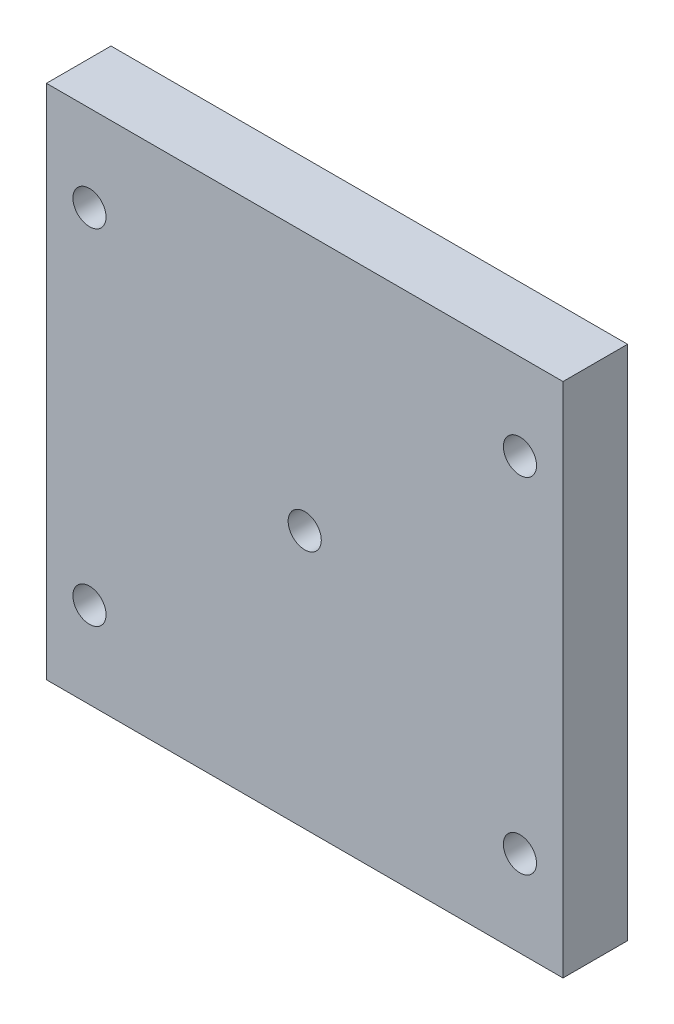
ISO-10303-21;
HEADER;
FILE_DESCRIPTION(('STEP AP214'),'2;1');
FILE_NAME('part.step','',(''),(''),'','','');
FILE_SCHEMA(('AUTOMOTIVE_DESIGN { 1 0 10303 214 1 1 1 1 }'));
ENDSEC;
DATA;
#1=APPLICATION_CONTEXT('core data for automotive mechanical design processes');
#2=APPLICATION_PROTOCOL_DEFINITION('international standard','automotive_design',2000,#1);
#3=PRODUCT_CONTEXT('',#1,'mechanical');
#4=PRODUCT('Part','Part','',(#3));
#5=PRODUCT_RELATED_PRODUCT_CATEGORY('part','',(#4));
#6=PRODUCT_DEFINITION_FORMATION('','',#4);
#7=PRODUCT_DEFINITION_CONTEXT('part definition',#1,'design');
#8=PRODUCT_DEFINITION('design','',#6,#7);
#9=PRODUCT_DEFINITION_SHAPE('','',#8);
#10=(LENGTH_UNIT() NAMED_UNIT(*) SI_UNIT(.MILLI.,.METRE.));
#11=(NAMED_UNIT(*) PLANE_ANGLE_UNIT() SI_UNIT($,.RADIAN.));
#12=(NAMED_UNIT(*) SI_UNIT($,.STERADIAN.) SOLID_ANGLE_UNIT());
#13=UNCERTAINTY_MEASURE_WITH_UNIT(LENGTH_MEASURE(1.E-05),#10,'distance_accuracy_value','');
#14=(GEOMETRIC_REPRESENTATION_CONTEXT(3) GLOBAL_UNCERTAINTY_ASSIGNED_CONTEXT((#13)) GLOBAL_UNIT_ASSIGNED_CONTEXT((#10,
#11,#12)) REPRESENTATION_CONTEXT('',''));
#15=CARTESIAN_POINT('',(0.,0.,0.));
#16=DIRECTION('',(0.,0.,1.));
#17=DIRECTION('',(1.,0.,0.));
#18=AXIS2_PLACEMENT_3D('',#15,#16,#17);
#19=CARTESIAN_POINT('',(-127.,101.6,0.));
#20=DIRECTION('',(0.,0.,1.));
#21=DIRECTION('',(1.,0.,0.));
#22=AXIS2_PLACEMENT_3D('',#19,#20,#21);
#23=CYLINDRICAL_SURFACE('',#22,6.5151);
#24=CARTESIAN_POINT('',(-127.,101.6,0.));
#25=DIRECTION('',(0.,0.,1.));
#26=DIRECTION('',(1.,0.,0.));
#27=AXIS2_PLACEMENT_3D('',#24,#25,#26);
#28=CIRCLE('',#27,6.5151);
#29=CARTESIAN_POINT('',(-120.4849,101.6,0.));
#30=VERTEX_POINT('',#29);
#31=EDGE_CURVE('E119',#30,#30,#28,.T.);
#32=CARTESIAN_POINT('',(-127.,101.6,15.875));
#33=DIRECTION('',(0.,0.,1.));
#34=DIRECTION('',(1.,0.,0.));
#35=AXIS2_PLACEMENT_3D('',#32,#33,#34);
#36=CIRCLE('',#35,6.5151);
#37=CARTESIAN_POINT('',(-120.4849,101.6,15.875));
#38=VERTEX_POINT('',#37);
#39=EDGE_CURVE('E53',#38,#38,#36,.F.);
#40=CARTESIAN_POINT('',(-120.4849,101.6,0.));
#41=CARTESIAN_POINT('',(-120.4849,101.6,0.165364583333334));
#42=CARTESIAN_POINT('',(-120.4849,101.6,0.330729166666667));
#43=CARTESIAN_POINT('',(-120.4849,101.6,0.661458333333333));
#44=CARTESIAN_POINT('',(-120.4849,101.6,0.826822916666666));
#45=CARTESIAN_POINT('',(-120.4849,101.6,1.15755208333333));
#46=CARTESIAN_POINT('',(-120.4849,101.6,1.32291666666667));
#47=CARTESIAN_POINT('',(-120.4849,101.6,1.65364583333333));
#48=CARTESIAN_POINT('',(-120.4849,101.6,1.81901041666667));
#49=CARTESIAN_POINT('',(-120.4849,101.6,2.14973958333333));
#50=CARTESIAN_POINT('',(-120.4849,101.6,2.31510416666667));
#51=CARTESIAN_POINT('',(-120.4849,101.6,2.64583333333333));
#52=CARTESIAN_POINT('',(-120.4849,101.6,2.81119791666667));
#53=CARTESIAN_POINT('',(-120.4849,101.6,3.14192708333333));
#54=CARTESIAN_POINT('',(-120.4849,101.6,3.30729166666667));
#55=CARTESIAN_POINT('',(-120.4849,101.6,3.63802083333333));
#56=CARTESIAN_POINT('',(-120.4849,101.6,3.80338541666667));
#57=CARTESIAN_POINT('',(-120.4849,101.6,4.13411458333333));
#58=CARTESIAN_POINT('',(-120.4849,101.6,4.29947916666667));
#59=CARTESIAN_POINT('',(-120.4849,101.6,4.63020833333333));
#60=CARTESIAN_POINT('',(-120.4849,101.6,4.79557291666667));
#61=CARTESIAN_POINT('',(-120.4849,101.6,5.12630208333333));
#62=CARTESIAN_POINT('',(-120.4849,101.6,5.29166666666667));
#63=CARTESIAN_POINT('',(-120.4849,101.6,5.62239583333333));
#64=CARTESIAN_POINT('',(-120.4849,101.6,5.78776041666667));
#65=CARTESIAN_POINT('',(-120.4849,101.6,6.11848958333333));
#66=CARTESIAN_POINT('',(-120.4849,101.6,6.28385416666667));
#67=CARTESIAN_POINT('',(-120.4849,101.6,6.61458333333333));
#68=CARTESIAN_POINT('',(-120.4849,101.6,6.77994791666667));
#69=CARTESIAN_POINT('',(-120.4849,101.6,7.11067708333333));
#70=CARTESIAN_POINT('',(-120.4849,101.6,7.27604166666667));
#71=CARTESIAN_POINT('',(-120.4849,101.6,7.60677083333333));
#72=CARTESIAN_POINT('',(-120.4849,101.6,7.77213541666667));
#73=CARTESIAN_POINT('',(-120.4849,101.6,8.10286458333333));
#74=CARTESIAN_POINT('',(-120.4849,101.6,8.26822916666666));
#75=CARTESIAN_POINT('',(-120.4849,101.6,8.59895833333333));
#76=CARTESIAN_POINT('',(-120.4849,101.6,8.76432291666666));
#77=CARTESIAN_POINT('',(-120.4849,101.6,9.09505208333333));
#78=CARTESIAN_POINT('',(-120.4849,101.6,9.26041666666666));
#79=CARTESIAN_POINT('',(-120.4849,101.6,9.59114583333333));
#80=CARTESIAN_POINT('',(-120.4849,101.6,9.75651041666667));
#81=CARTESIAN_POINT('',(-120.4849,101.6,10.0872395833333));
#82=CARTESIAN_POINT('',(-120.4849,101.6,10.2526041666667));
#83=CARTESIAN_POINT('',(-120.4849,101.6,10.5833333333333));
#84=CARTESIAN_POINT('',(-120.4849,101.6,10.7486979166667));
#85=CARTESIAN_POINT('',(-120.4849,101.6,11.0794270833333));
#86=CARTESIAN_POINT('',(-120.4849,101.6,11.2447916666667));
#87=CARTESIAN_POINT('',(-120.4849,101.6,11.5755208333333));
#88=CARTESIAN_POINT('',(-120.4849,101.6,11.7408854166667));
#89=CARTESIAN_POINT('',(-120.4849,101.6,12.0716145833333));
#90=CARTESIAN_POINT('',(-120.4849,101.6,12.2369791666667));
#91=CARTESIAN_POINT('',(-120.4849,101.6,12.5677083333333));
#92=CARTESIAN_POINT('',(-120.4849,101.6,12.7330729166667));
#93=CARTESIAN_POINT('',(-120.4849,101.6,13.0638020833333));
#94=CARTESIAN_POINT('',(-120.4849,101.6,13.2291666666667));
#95=CARTESIAN_POINT('',(-120.4849,101.6,13.5598958333333));
#96=CARTESIAN_POINT('',(-120.4849,101.6,13.7252604166667));
#97=CARTESIAN_POINT('',(-120.4849,101.6,14.0559895833333));
#98=CARTESIAN_POINT('',(-120.4849,101.6,14.2213541666667));
#99=CARTESIAN_POINT('',(-120.4849,101.6,14.5520833333333));
#100=CARTESIAN_POINT('',(-120.4849,101.6,14.7174479166667));
#101=CARTESIAN_POINT('',(-120.4849,101.6,15.0481770833333));
#102=CARTESIAN_POINT('',(-120.4849,101.6,15.2135416666667));
#103=CARTESIAN_POINT('',(-120.4849,101.6,15.5442708333333));
#104=CARTESIAN_POINT('',(-120.4849,101.6,15.7096354166667));
#105=CARTESIAN_POINT('',(-120.4849,101.6,15.875));
#106=B_SPLINE_CURVE_WITH_KNOTS('',3,(#40,#41,#42,#43,#44,#45,#46,#47,#48,#49,#50,#51,#52,#53,
#54,#55,#56,#57,#58,#59,#60,#61,#62,#63,#64,#65,#66,#67,#68,#69,#70,#71,#72,#73,#74,#75,#76,#77,
#78,#79,#80,#81,#82,#83,#84,#85,#86,#87,#88,#89,#90,#91,#92,#93,#94,#95,#96,#97,#98,#99,#100,
#101,#102,#103,#104,#105),.UNSPECIFIED.,.F.,.F.,(4,2,2,2,2,2,2,2,2,2,2,2,2,2,2,2,2,2,2,2,2,2,2,
2,2,2,2,2,2,2,2,2,4),(0.,0.49609375,0.9921875,1.48828125,1.984375,2.48046875,2.9765625,
3.47265625,3.96875,4.46484375,4.9609375,5.45703125,5.953125,6.44921875,6.9453125,7.44140625,
7.9375,8.43359375,8.9296875,9.42578125,9.921875,10.41796875,10.9140625,11.41015625,11.90625,
12.40234375,12.8984375,13.39453125,13.890625,14.38671875,14.8828125,15.37890625,15.875),.UNSPECIFIED.);
#107=EDGE_CURVE('BSEAM49',#30,#38,#106,.T.);
#108=ORIENTED_EDGE('',*,*,#31,.F.);
#109=ORIENTED_EDGE('',*,*,#39,.F.);
#110=ORIENTED_EDGE('',*,*,#107,.T.);
#111=ORIENTED_EDGE('',*,*,#107,.F.);
#112=EDGE_LOOP('',(#108,#110,#109,#111));
#113=FACE_BOUND('',#112,.T.);
#114=ADVANCED_FACE('F49',(#113),#23,.F.);
#115=CARTESIAN_POINT('',(127.,101.6,0.));
#116=DIRECTION('',(0.,0.,1.));
#117=DIRECTION('',(1.,0.,0.));
#118=AXIS2_PLACEMENT_3D('',#115,#116,#117);
#119=CYLINDRICAL_SURFACE('',#118,6.51509999999999);
#120=CARTESIAN_POINT('',(127.,101.6,0.));
#121=DIRECTION('',(0.,0.,1.));
#122=DIRECTION('',(1.,0.,0.));
#123=AXIS2_PLACEMENT_3D('',#120,#121,#122);
#124=CIRCLE('',#123,6.51509999999999);
#125=CARTESIAN_POINT('',(133.5151,101.6,0.));
#126=VERTEX_POINT('',#125);
#127=EDGE_CURVE('E157',#126,#126,#124,.T.);
#128=CARTESIAN_POINT('',(127.,101.6,15.875));
#129=DIRECTION('',(0.,0.,1.));
#130=DIRECTION('',(1.,0.,0.));
#131=AXIS2_PLACEMENT_3D('',#128,#129,#130);
#132=CIRCLE('',#131,6.51509999999999);
#133=CARTESIAN_POINT('',(133.5151,101.6,15.875));
#134=VERTEX_POINT('',#133);
#135=EDGE_CURVE('E134',#134,#134,#132,.F.);
#136=CARTESIAN_POINT('',(133.5151,101.6,0.));
#137=CARTESIAN_POINT('',(133.5151,101.6,0.165364583333334));
#138=CARTESIAN_POINT('',(133.5151,101.6,0.330729166666667));
#139=CARTESIAN_POINT('',(133.5151,101.6,0.661458333333333));
#140=CARTESIAN_POINT('',(133.5151,101.6,0.826822916666666));
#141=CARTESIAN_POINT('',(133.5151,101.6,1.15755208333333));
#142=CARTESIAN_POINT('',(133.5151,101.6,1.32291666666667));
#143=CARTESIAN_POINT('',(133.5151,101.6,1.65364583333333));
#144=CARTESIAN_POINT('',(133.5151,101.6,1.81901041666667));
#145=CARTESIAN_POINT('',(133.5151,101.6,2.14973958333333));
#146=CARTESIAN_POINT('',(133.5151,101.6,2.31510416666667));
#147=CARTESIAN_POINT('',(133.5151,101.6,2.64583333333333));
#148=CARTESIAN_POINT('',(133.5151,101.6,2.81119791666667));
#149=CARTESIAN_POINT('',(133.5151,101.6,3.14192708333333));
#150=CARTESIAN_POINT('',(133.5151,101.6,3.30729166666667));
#151=CARTESIAN_POINT('',(133.5151,101.6,3.63802083333333));
#152=CARTESIAN_POINT('',(133.5151,101.6,3.80338541666667));
#153=CARTESIAN_POINT('',(133.5151,101.6,4.13411458333333));
#154=CARTESIAN_POINT('',(133.5151,101.6,4.29947916666667));
#155=CARTESIAN_POINT('',(133.5151,101.6,4.63020833333333));
#156=CARTESIAN_POINT('',(133.5151,101.6,4.79557291666667));
#157=CARTESIAN_POINT('',(133.5151,101.6,5.12630208333333));
#158=CARTESIAN_POINT('',(133.5151,101.6,5.29166666666667));
#159=CARTESIAN_POINT('',(133.5151,101.6,5.62239583333333));
#160=CARTESIAN_POINT('',(133.5151,101.6,5.78776041666667));
#161=CARTESIAN_POINT('',(133.5151,101.6,6.11848958333333));
#162=CARTESIAN_POINT('',(133.5151,101.6,6.28385416666667));
#163=CARTESIAN_POINT('',(133.5151,101.6,6.61458333333333));
#164=CARTESIAN_POINT('',(133.5151,101.6,6.77994791666667));
#165=CARTESIAN_POINT('',(133.5151,101.6,7.11067708333333));
#166=CARTESIAN_POINT('',(133.5151,101.6,7.27604166666667));
#167=CARTESIAN_POINT('',(133.5151,101.6,7.60677083333333));
#168=CARTESIAN_POINT('',(133.5151,101.6,7.77213541666667));
#169=CARTESIAN_POINT('',(133.5151,101.6,8.10286458333333));
#170=CARTESIAN_POINT('',(133.5151,101.6,8.26822916666666));
#171=CARTESIAN_POINT('',(133.5151,101.6,8.59895833333333));
#172=CARTESIAN_POINT('',(133.5151,101.6,8.76432291666666));
#173=CARTESIAN_POINT('',(133.5151,101.6,9.09505208333333));
#174=CARTESIAN_POINT('',(133.5151,101.6,9.26041666666666));
#175=CARTESIAN_POINT('',(133.5151,101.6,9.59114583333333));
#176=CARTESIAN_POINT('',(133.5151,101.6,9.75651041666667));
#177=CARTESIAN_POINT('',(133.5151,101.6,10.0872395833333));
#178=CARTESIAN_POINT('',(133.5151,101.6,10.2526041666667));
#179=CARTESIAN_POINT('',(133.5151,101.6,10.5833333333333));
#180=CARTESIAN_POINT('',(133.5151,101.6,10.7486979166667));
#181=CARTESIAN_POINT('',(133.5151,101.6,11.0794270833333));
#182=CARTESIAN_POINT('',(133.5151,101.6,11.2447916666667));
#183=CARTESIAN_POINT('',(133.5151,101.6,11.5755208333333));
#184=CARTESIAN_POINT('',(133.5151,101.6,11.7408854166667));
#185=CARTESIAN_POINT('',(133.5151,101.6,12.0716145833333));
#186=CARTESIAN_POINT('',(133.5151,101.6,12.2369791666667));
#187=CARTESIAN_POINT('',(133.5151,101.6,12.5677083333333));
#188=CARTESIAN_POINT('',(133.5151,101.6,12.7330729166667));
#189=CARTESIAN_POINT('',(133.5151,101.6,13.0638020833333));
#190=CARTESIAN_POINT('',(133.5151,101.6,13.2291666666667));
#191=CARTESIAN_POINT('',(133.5151,101.6,13.5598958333333));
#192=CARTESIAN_POINT('',(133.5151,101.6,13.7252604166667));
#193=CARTESIAN_POINT('',(133.5151,101.6,14.0559895833333));
#194=CARTESIAN_POINT('',(133.5151,101.6,14.2213541666667));
#195=CARTESIAN_POINT('',(133.5151,101.6,14.5520833333333));
#196=CARTESIAN_POINT('',(133.5151,101.6,14.7174479166667));
#197=CARTESIAN_POINT('',(133.5151,101.6,15.0481770833333));
#198=CARTESIAN_POINT('',(133.5151,101.6,15.2135416666667));
#199=CARTESIAN_POINT('',(133.5151,101.6,15.5442708333333));
#200=CARTESIAN_POINT('',(133.5151,101.6,15.7096354166667));
#201=CARTESIAN_POINT('',(133.5151,101.6,15.875));
#202=B_SPLINE_CURVE_WITH_KNOTS('',3,(#136,#137,#138,#139,#140,#141,#142,#143,#144,#145,#146,
#147,#148,#149,#150,#151,#152,#153,#154,#155,#156,#157,#158,#159,#160,#161,#162,#163,#164,#165,
#166,#167,#168,#169,#170,#171,#172,#173,#174,#175,#176,#177,#178,#179,#180,#181,#182,#183,#184,
#185,#186,#187,#188,#189,#190,#191,#192,#193,#194,#195,#196,#197,#198,#199,#200,#201),
.UNSPECIFIED.,.F.,.F.,(4,2,2,2,2,2,2,2,2,2,2,2,2,2,2,2,2,2,2,2,2,2,2,2,2,2,2,2,2,2,2,2,4),(0.,
0.49609375,0.9921875,1.48828125,1.984375,2.48046875,2.9765625,3.47265625,3.96875,4.46484375,
4.9609375,5.45703125,5.953125,6.44921875,6.9453125,7.44140625,7.9375,8.43359375,8.9296875,
9.42578125,9.921875,10.41796875,10.9140625,11.41015625,11.90625,12.40234375,12.8984375,
13.39453125,13.890625,14.38671875,14.8828125,15.37890625,15.875),.UNSPECIFIED.);
#203=EDGE_CURVE('BSEAM222',#126,#134,#202,.T.);
#204=ORIENTED_EDGE('',*,*,#127,.F.);
#205=ORIENTED_EDGE('',*,*,#135,.F.);
#206=ORIENTED_EDGE('',*,*,#203,.T.);
#207=ORIENTED_EDGE('',*,*,#203,.F.);
#208=EDGE_LOOP('',(#204,#206,#205,#207));
#209=FACE_BOUND('',#208,.T.);
#210=ADVANCED_FACE('F222',(#209),#119,.F.);
#211=CARTESIAN_POINT('',(127.,-101.6,0.));
#212=DIRECTION('',(0.,0.,1.));
#213=DIRECTION('',(1.,0.,0.));
#214=AXIS2_PLACEMENT_3D('',#211,#212,#213);
#215=CYLINDRICAL_SURFACE('',#214,6.51509999999999);
#216=CARTESIAN_POINT('',(127.,-101.6,0.));
#217=DIRECTION('',(0.,0.,1.));
#218=DIRECTION('',(1.,0.,0.));
#219=AXIS2_PLACEMENT_3D('',#216,#217,#218);
#220=CIRCLE('',#219,6.51509999999999);
#221=CARTESIAN_POINT('',(133.5151,-101.6,0.));
#222=VERTEX_POINT('',#221);
#223=EDGE_CURVE('E151',#222,#222,#220,.T.);
#224=CARTESIAN_POINT('',(127.,-101.6,15.875));
#225=DIRECTION('',(0.,0.,1.));
#226=DIRECTION('',(1.,0.,0.));
#227=AXIS2_PLACEMENT_3D('',#224,#225,#226);
#228=CIRCLE('',#227,6.51509999999999);
#229=CARTESIAN_POINT('',(133.5151,-101.6,15.875));
#230=VERTEX_POINT('',#229);
#231=EDGE_CURVE('E132',#230,#230,#228,.F.);
#232=CARTESIAN_POINT('',(133.5151,-101.6,0.));
#233=CARTESIAN_POINT('',(133.5151,-101.6,0.165364583333334));
#234=CARTESIAN_POINT('',(133.5151,-101.6,0.330729166666667));
#235=CARTESIAN_POINT('',(133.5151,-101.6,0.661458333333333));
#236=CARTESIAN_POINT('',(133.5151,-101.6,0.826822916666666));
#237=CARTESIAN_POINT('',(133.5151,-101.6,1.15755208333333));
#238=CARTESIAN_POINT('',(133.5151,-101.6,1.32291666666667));
#239=CARTESIAN_POINT('',(133.5151,-101.6,1.65364583333333));
#240=CARTESIAN_POINT('',(133.5151,-101.6,1.81901041666667));
#241=CARTESIAN_POINT('',(133.5151,-101.6,2.14973958333333));
#242=CARTESIAN_POINT('',(133.5151,-101.6,2.31510416666667));
#243=CARTESIAN_POINT('',(133.5151,-101.6,2.64583333333333));
#244=CARTESIAN_POINT('',(133.5151,-101.6,2.81119791666667));
#245=CARTESIAN_POINT('',(133.5151,-101.6,3.14192708333333));
#246=CARTESIAN_POINT('',(133.5151,-101.6,3.30729166666667));
#247=CARTESIAN_POINT('',(133.5151,-101.6,3.63802083333333));
#248=CARTESIAN_POINT('',(133.5151,-101.6,3.80338541666667));
#249=CARTESIAN_POINT('',(133.5151,-101.6,4.13411458333333));
#250=CARTESIAN_POINT('',(133.5151,-101.6,4.29947916666667));
#251=CARTESIAN_POINT('',(133.5151,-101.6,4.63020833333333));
#252=CARTESIAN_POINT('',(133.5151,-101.6,4.79557291666667));
#253=CARTESIAN_POINT('',(133.5151,-101.6,5.12630208333333));
#254=CARTESIAN_POINT('',(133.5151,-101.6,5.29166666666667));
#255=CARTESIAN_POINT('',(133.5151,-101.6,5.62239583333333));
#256=CARTESIAN_POINT('',(133.5151,-101.6,5.78776041666667));
#257=CARTESIAN_POINT('',(133.5151,-101.6,6.11848958333333));
#258=CARTESIAN_POINT('',(133.5151,-101.6,6.28385416666667));
#259=CARTESIAN_POINT('',(133.5151,-101.6,6.61458333333333));
#260=CARTESIAN_POINT('',(133.5151,-101.6,6.77994791666667));
#261=CARTESIAN_POINT('',(133.5151,-101.6,7.11067708333333));
#262=CARTESIAN_POINT('',(133.5151,-101.6,7.27604166666667));
#263=CARTESIAN_POINT('',(133.5151,-101.6,7.60677083333333));
#264=CARTESIAN_POINT('',(133.5151,-101.6,7.77213541666667));
#265=CARTESIAN_POINT('',(133.5151,-101.6,8.10286458333333));
#266=CARTESIAN_POINT('',(133.5151,-101.6,8.26822916666666));
#267=CARTESIAN_POINT('',(133.5151,-101.6,8.59895833333333));
#268=CARTESIAN_POINT('',(133.5151,-101.6,8.76432291666666));
#269=CARTESIAN_POINT('',(133.5151,-101.6,9.09505208333333));
#270=CARTESIAN_POINT('',(133.5151,-101.6,9.26041666666666));
#271=CARTESIAN_POINT('',(133.5151,-101.6,9.59114583333333));
#272=CARTESIAN_POINT('',(133.5151,-101.6,9.75651041666667));
#273=CARTESIAN_POINT('',(133.5151,-101.6,10.0872395833333));
#274=CARTESIAN_POINT('',(133.5151,-101.6,10.2526041666667));
#275=CARTESIAN_POINT('',(133.5151,-101.6,10.5833333333333));
#276=CARTESIAN_POINT('',(133.5151,-101.6,10.7486979166667));
#277=CARTESIAN_POINT('',(133.5151,-101.6,11.0794270833333));
#278=CARTESIAN_POINT('',(133.5151,-101.6,11.2447916666667));
#279=CARTESIAN_POINT('',(133.5151,-101.6,11.5755208333333));
#280=CARTESIAN_POINT('',(133.5151,-101.6,11.7408854166667));
#281=CARTESIAN_POINT('',(133.5151,-101.6,12.0716145833333));
#282=CARTESIAN_POINT('',(133.5151,-101.6,12.2369791666667));
#283=CARTESIAN_POINT('',(133.5151,-101.6,12.5677083333333));
#284=CARTESIAN_POINT('',(133.5151,-101.6,12.7330729166667));
#285=CARTESIAN_POINT('',(133.5151,-101.6,13.0638020833333));
#286=CARTESIAN_POINT('',(133.5151,-101.6,13.2291666666667));
#287=CARTESIAN_POINT('',(133.5151,-101.6,13.5598958333333));
#288=CARTESIAN_POINT('',(133.5151,-101.6,13.7252604166667));
#289=CARTESIAN_POINT('',(133.5151,-101.6,14.0559895833333));
#290=CARTESIAN_POINT('',(133.5151,-101.6,14.2213541666667));
#291=CARTESIAN_POINT('',(133.5151,-101.6,14.5520833333333));
#292=CARTESIAN_POINT('',(133.5151,-101.6,14.7174479166667));
#293=CARTESIAN_POINT('',(133.5151,-101.6,15.0481770833333));
#294=CARTESIAN_POINT('',(133.5151,-101.6,15.2135416666667));
#295=CARTESIAN_POINT('',(133.5151,-101.6,15.5442708333333));
#296=CARTESIAN_POINT('',(133.5151,-101.6,15.7096354166667));
#297=CARTESIAN_POINT('',(133.5151,-101.6,15.875));
#298=B_SPLINE_CURVE_WITH_KNOTS('',3,(#232,#233,#234,#235,#236,#237,#238,#239,#240,#241,#242,
#243,#244,#245,#246,#247,#248,#249,#250,#251,#252,#253,#254,#255,#256,#257,#258,#259,#260,#261,
#262,#263,#264,#265,#266,#267,#268,#269,#270,#271,#272,#273,#274,#275,#276,#277,#278,#279,#280,
#281,#282,#283,#284,#285,#286,#287,#288,#289,#290,#291,#292,#293,#294,#295,#296,#297),
.UNSPECIFIED.,.F.,.F.,(4,2,2,2,2,2,2,2,2,2,2,2,2,2,2,2,2,2,2,2,2,2,2,2,2,2,2,2,2,2,2,2,4),(0.,
0.49609375,0.9921875,1.48828125,1.984375,2.48046875,2.9765625,3.47265625,3.96875,4.46484375,
4.9609375,5.45703125,5.953125,6.44921875,6.9453125,7.44140625,7.9375,8.43359375,8.9296875,
9.42578125,9.921875,10.41796875,10.9140625,11.41015625,11.90625,12.40234375,12.8984375,
13.39453125,13.890625,14.38671875,14.8828125,15.37890625,15.875),.UNSPECIFIED.);
#299=EDGE_CURVE('BSEAM229',#222,#230,#298,.T.);
#300=ORIENTED_EDGE('',*,*,#223,.F.);
#301=ORIENTED_EDGE('',*,*,#231,.F.);
#302=ORIENTED_EDGE('',*,*,#299,.T.);
#303=ORIENTED_EDGE('',*,*,#299,.F.);
#304=EDGE_LOOP('',(#300,#302,#301,#303));
#305=FACE_BOUND('',#304,.T.);
#306=ADVANCED_FACE('F229',(#305),#215,.F.);
#307=CARTESIAN_POINT('',(-127.,-101.6,0.));
#308=DIRECTION('',(0.,0.,1.));
#309=DIRECTION('',(1.,0.,0.));
#310=AXIS2_PLACEMENT_3D('',#307,#308,#309);
#311=CYLINDRICAL_SURFACE('',#310,6.5151);
#312=CARTESIAN_POINT('',(-127.,-101.6,0.));
#313=DIRECTION('',(0.,0.,1.));
#314=DIRECTION('',(1.,0.,0.));
#315=AXIS2_PLACEMENT_3D('',#312,#313,#314);
#316=CIRCLE('',#315,6.5151);
#317=CARTESIAN_POINT('',(-120.4849,-101.6,0.));
#318=VERTEX_POINT('',#317);
#319=EDGE_CURVE('E144',#318,#318,#316,.T.);
#320=CARTESIAN_POINT('',(-127.,-101.6,15.875));
#321=DIRECTION('',(0.,0.,1.));
#322=DIRECTION('',(1.,0.,0.));
#323=AXIS2_PLACEMENT_3D('',#320,#321,#322);
#324=CIRCLE('',#323,6.5151);
#325=CARTESIAN_POINT('',(-120.4849,-101.6,15.875));
#326=VERTEX_POINT('',#325);
#327=EDGE_CURVE('E128',#326,#326,#324,.F.);
#328=CARTESIAN_POINT('',(-120.4849,-101.6,0.));
#329=CARTESIAN_POINT('',(-120.4849,-101.6,0.165364583333334));
#330=CARTESIAN_POINT('',(-120.4849,-101.6,0.330729166666667));
#331=CARTESIAN_POINT('',(-120.4849,-101.6,0.661458333333333));
#332=CARTESIAN_POINT('',(-120.4849,-101.6,0.826822916666666));
#333=CARTESIAN_POINT('',(-120.4849,-101.6,1.15755208333333));
#334=CARTESIAN_POINT('',(-120.4849,-101.6,1.32291666666667));
#335=CARTESIAN_POINT('',(-120.4849,-101.6,1.65364583333333));
#336=CARTESIAN_POINT('',(-120.4849,-101.6,1.81901041666667));
#337=CARTESIAN_POINT('',(-120.4849,-101.6,2.14973958333333));
#338=CARTESIAN_POINT('',(-120.4849,-101.6,2.31510416666667));
#339=CARTESIAN_POINT('',(-120.4849,-101.6,2.64583333333333));
#340=CARTESIAN_POINT('',(-120.4849,-101.6,2.81119791666667));
#341=CARTESIAN_POINT('',(-120.4849,-101.6,3.14192708333333));
#342=CARTESIAN_POINT('',(-120.4849,-101.6,3.30729166666667));
#343=CARTESIAN_POINT('',(-120.4849,-101.6,3.63802083333333));
#344=CARTESIAN_POINT('',(-120.4849,-101.6,3.80338541666667));
#345=CARTESIAN_POINT('',(-120.4849,-101.6,4.13411458333333));
#346=CARTESIAN_POINT('',(-120.4849,-101.6,4.29947916666667));
#347=CARTESIAN_POINT('',(-120.4849,-101.6,4.63020833333333));
#348=CARTESIAN_POINT('',(-120.4849,-101.6,4.79557291666667));
#349=CARTESIAN_POINT('',(-120.4849,-101.6,5.12630208333333));
#350=CARTESIAN_POINT('',(-120.4849,-101.6,5.29166666666667));
#351=CARTESIAN_POINT('',(-120.4849,-101.6,5.62239583333333));
#352=CARTESIAN_POINT('',(-120.4849,-101.6,5.78776041666667));
#353=CARTESIAN_POINT('',(-120.4849,-101.6,6.11848958333333));
#354=CARTESIAN_POINT('',(-120.4849,-101.6,6.28385416666667));
#355=CARTESIAN_POINT('',(-120.4849,-101.6,6.61458333333333));
#356=CARTESIAN_POINT('',(-120.4849,-101.6,6.77994791666667));
#357=CARTESIAN_POINT('',(-120.4849,-101.6,7.11067708333333));
#358=CARTESIAN_POINT('',(-120.4849,-101.6,7.27604166666667));
#359=CARTESIAN_POINT('',(-120.4849,-101.6,7.60677083333333));
#360=CARTESIAN_POINT('',(-120.4849,-101.6,7.77213541666667));
#361=CARTESIAN_POINT('',(-120.4849,-101.6,8.10286458333333));
#362=CARTESIAN_POINT('',(-120.4849,-101.6,8.26822916666666));
#363=CARTESIAN_POINT('',(-120.4849,-101.6,8.59895833333333));
#364=CARTESIAN_POINT('',(-120.4849,-101.6,8.76432291666666));
#365=CARTESIAN_POINT('',(-120.4849,-101.6,9.09505208333333));
#366=CARTESIAN_POINT('',(-120.4849,-101.6,9.26041666666666));
#367=CARTESIAN_POINT('',(-120.4849,-101.6,9.59114583333333));
#368=CARTESIAN_POINT('',(-120.4849,-101.6,9.75651041666667));
#369=CARTESIAN_POINT('',(-120.4849,-101.6,10.0872395833333));
#370=CARTESIAN_POINT('',(-120.4849,-101.6,10.2526041666667));
#371=CARTESIAN_POINT('',(-120.4849,-101.6,10.5833333333333));
#372=CARTESIAN_POINT('',(-120.4849,-101.6,10.7486979166667));
#373=CARTESIAN_POINT('',(-120.4849,-101.6,11.0794270833333));
#374=CARTESIAN_POINT('',(-120.4849,-101.6,11.2447916666667));
#375=CARTESIAN_POINT('',(-120.4849,-101.6,11.5755208333333));
#376=CARTESIAN_POINT('',(-120.4849,-101.6,11.7408854166667));
#377=CARTESIAN_POINT('',(-120.4849,-101.6,12.0716145833333));
#378=CARTESIAN_POINT('',(-120.4849,-101.6,12.2369791666667));
#379=CARTESIAN_POINT('',(-120.4849,-101.6,12.5677083333333));
#380=CARTESIAN_POINT('',(-120.4849,-101.6,12.7330729166667));
#381=CARTESIAN_POINT('',(-120.4849,-101.6,13.0638020833333));
#382=CARTESIAN_POINT('',(-120.4849,-101.6,13.2291666666667));
#383=CARTESIAN_POINT('',(-120.4849,-101.6,13.5598958333333));
#384=CARTESIAN_POINT('',(-120.4849,-101.6,13.7252604166667));
#385=CARTESIAN_POINT('',(-120.4849,-101.6,14.0559895833333));
#386=CARTESIAN_POINT('',(-120.4849,-101.6,14.2213541666667));
#387=CARTESIAN_POINT('',(-120.4849,-101.6,14.5520833333333));
#388=CARTESIAN_POINT('',(-120.4849,-101.6,14.7174479166667));
#389=CARTESIAN_POINT('',(-120.4849,-101.6,15.0481770833333));
#390=CARTESIAN_POINT('',(-120.4849,-101.6,15.2135416666667));
#391=CARTESIAN_POINT('',(-120.4849,-101.6,15.5442708333333));
#392=CARTESIAN_POINT('',(-120.4849,-101.6,15.7096354166667));
#393=CARTESIAN_POINT('',(-120.4849,-101.6,15.875));
#394=B_SPLINE_CURVE_WITH_KNOTS('',3,(#328,#329,#330,#331,#332,#333,#334,#335,#336,#337,#338,
#339,#340,#341,#342,#343,#344,#345,#346,#347,#348,#349,#350,#351,#352,#353,#354,#355,#356,#357,
#358,#359,#360,#361,#362,#363,#364,#365,#366,#367,#368,#369,#370,#371,#372,#373,#374,#375,#376,
#377,#378,#379,#380,#381,#382,#383,#384,#385,#386,#387,#388,#389,#390,#391,#392,#393),
.UNSPECIFIED.,.F.,.F.,(4,2,2,2,2,2,2,2,2,2,2,2,2,2,2,2,2,2,2,2,2,2,2,2,2,2,2,2,2,2,2,2,4),(0.,
0.49609375,0.9921875,1.48828125,1.984375,2.48046875,2.9765625,3.47265625,3.96875,4.46484375,
4.9609375,5.45703125,5.953125,6.44921875,6.9453125,7.44140625,7.9375,8.43359375,8.9296875,
9.42578125,9.921875,10.41796875,10.9140625,11.41015625,11.90625,12.40234375,12.8984375,
13.39453125,13.890625,14.38671875,14.8828125,15.37890625,15.875),.UNSPECIFIED.);
#395=EDGE_CURVE('BSEAM255',#318,#326,#394,.T.);
#396=ORIENTED_EDGE('',*,*,#319,.F.);
#397=ORIENTED_EDGE('',*,*,#327,.F.);
#398=ORIENTED_EDGE('',*,*,#395,.T.);
#399=ORIENTED_EDGE('',*,*,#395,.F.);
#400=EDGE_LOOP('',(#396,#398,#397,#399));
#401=FACE_BOUND('',#400,.T.);
#402=ADVANCED_FACE('F255',(#401),#311,.F.);
#403=CARTESIAN_POINT('',(0.,0.,0.));
#404=DIRECTION('',(0.,0.,1.));
#405=DIRECTION('',(1.,0.,0.));
#406=AXIS2_PLACEMENT_3D('',#403,#404,#405);
#407=CYLINDRICAL_SURFACE('',#406,6.5151);
#408=CARTESIAN_POINT('',(0.,0.,0.));
#409=DIRECTION('',(0.,0.,1.));
#410=DIRECTION('',(1.,0.,0.));
#411=AXIS2_PLACEMENT_3D('',#408,#409,#410);
#412=CIRCLE('',#411,6.5151);
#413=CARTESIAN_POINT('',(6.51509999999997,0.,0.));
#414=VERTEX_POINT('',#413);
#415=EDGE_CURVE('E139',#414,#414,#412,.T.);
#416=CARTESIAN_POINT('',(0.,0.,15.875));
#417=DIRECTION('',(0.,0.,1.));
#418=DIRECTION('',(1.,0.,0.));
#419=AXIS2_PLACEMENT_3D('',#416,#417,#418);
#420=CIRCLE('',#419,6.5151);
#421=CARTESIAN_POINT('',(6.51509999999997,0.,15.875));
#422=VERTEX_POINT('',#421);
#423=EDGE_CURVE('E125',#422,#422,#420,.F.);
#424=CARTESIAN_POINT('',(6.51509999999997,0.,0.));
#425=CARTESIAN_POINT('',(6.51509999999997,0.,0.165364583333334));
#426=CARTESIAN_POINT('',(6.51509999999997,0.,0.330729166666667));
#427=CARTESIAN_POINT('',(6.51509999999997,0.,0.661458333333333));
#428=CARTESIAN_POINT('',(6.51509999999997,0.,0.826822916666666));
#429=CARTESIAN_POINT('',(6.51509999999997,0.,1.15755208333333));
#430=CARTESIAN_POINT('',(6.51509999999997,0.,1.32291666666667));
#431=CARTESIAN_POINT('',(6.51509999999997,0.,1.65364583333333));
#432=CARTESIAN_POINT('',(6.51509999999997,0.,1.81901041666667));
#433=CARTESIAN_POINT('',(6.51509999999997,0.,2.14973958333333));
#434=CARTESIAN_POINT('',(6.51509999999997,0.,2.31510416666667));
#435=CARTESIAN_POINT('',(6.51509999999997,0.,2.64583333333333));
#436=CARTESIAN_POINT('',(6.51509999999997,0.,2.81119791666667));
#437=CARTESIAN_POINT('',(6.51509999999997,0.,3.14192708333333));
#438=CARTESIAN_POINT('',(6.51509999999997,0.,3.30729166666667));
#439=CARTESIAN_POINT('',(6.51509999999997,0.,3.63802083333333));
#440=CARTESIAN_POINT('',(6.51509999999997,0.,3.80338541666667));
#441=CARTESIAN_POINT('',(6.51509999999997,0.,4.13411458333333));
#442=CARTESIAN_POINT('',(6.51509999999997,0.,4.29947916666667));
#443=CARTESIAN_POINT('',(6.51509999999997,0.,4.63020833333333));
#444=CARTESIAN_POINT('',(6.51509999999997,0.,4.79557291666667));
#445=CARTESIAN_POINT('',(6.51509999999997,0.,5.12630208333333));
#446=CARTESIAN_POINT('',(6.51509999999997,0.,5.29166666666667));
#447=CARTESIAN_POINT('',(6.51509999999997,0.,5.62239583333333));
#448=CARTESIAN_POINT('',(6.51509999999997,0.,5.78776041666667));
#449=CARTESIAN_POINT('',(6.51509999999997,0.,6.11848958333333));
#450=CARTESIAN_POINT('',(6.51509999999997,0.,6.28385416666667));
#451=CARTESIAN_POINT('',(6.51509999999997,0.,6.61458333333333));
#452=CARTESIAN_POINT('',(6.51509999999997,0.,6.77994791666667));
#453=CARTESIAN_POINT('',(6.51509999999997,0.,7.11067708333333));
#454=CARTESIAN_POINT('',(6.51509999999997,0.,7.27604166666667));
#455=CARTESIAN_POINT('',(6.51509999999997,0.,7.60677083333333));
#456=CARTESIAN_POINT('',(6.51509999999997,0.,7.77213541666667));
#457=CARTESIAN_POINT('',(6.51509999999997,0.,8.10286458333333));
#458=CARTESIAN_POINT('',(6.51509999999997,0.,8.26822916666666));
#459=CARTESIAN_POINT('',(6.51509999999997,0.,8.59895833333333));
#460=CARTESIAN_POINT('',(6.51509999999997,0.,8.76432291666666));
#461=CARTESIAN_POINT('',(6.51509999999997,0.,9.09505208333333));
#462=CARTESIAN_POINT('',(6.51509999999997,0.,9.26041666666666));
#463=CARTESIAN_POINT('',(6.51509999999997,0.,9.59114583333333));
#464=CARTESIAN_POINT('',(6.51509999999997,0.,9.75651041666667));
#465=CARTESIAN_POINT('',(6.51509999999997,0.,10.0872395833333));
#466=CARTESIAN_POINT('',(6.51509999999997,0.,10.2526041666667));
#467=CARTESIAN_POINT('',(6.51509999999997,0.,10.5833333333333));
#468=CARTESIAN_POINT('',(6.51509999999997,0.,10.7486979166667));
#469=CARTESIAN_POINT('',(6.51509999999997,0.,11.0794270833333));
#470=CARTESIAN_POINT('',(6.51509999999997,0.,11.2447916666667));
#471=CARTESIAN_POINT('',(6.51509999999997,0.,11.5755208333333));
#472=CARTESIAN_POINT('',(6.51509999999997,0.,11.7408854166667));
#473=CARTESIAN_POINT('',(6.51509999999997,0.,12.0716145833333));
#474=CARTESIAN_POINT('',(6.51509999999997,0.,12.2369791666667));
#475=CARTESIAN_POINT('',(6.51509999999997,0.,12.5677083333333));
#476=CARTESIAN_POINT('',(6.51509999999997,0.,12.7330729166667));
#477=CARTESIAN_POINT('',(6.51509999999997,0.,13.0638020833333));
#478=CARTESIAN_POINT('',(6.51509999999997,0.,13.2291666666667));
#479=CARTESIAN_POINT('',(6.51509999999997,0.,13.5598958333333));
#480=CARTESIAN_POINT('',(6.51509999999997,0.,13.7252604166667));
#481=CARTESIAN_POINT('',(6.51509999999997,0.,14.0559895833333));
#482=CARTESIAN_POINT('',(6.51509999999997,0.,14.2213541666667));
#483=CARTESIAN_POINT('',(6.51509999999997,0.,14.5520833333333));
#484=CARTESIAN_POINT('',(6.51509999999997,0.,14.7174479166667));
#485=CARTESIAN_POINT('',(6.51509999999997,0.,15.0481770833333));
#486=CARTESIAN_POINT('',(6.51509999999997,0.,15.2135416666667));
#487=CARTESIAN_POINT('',(6.51509999999997,0.,15.5442708333333));
#488=CARTESIAN_POINT('',(6.51509999999997,0.,15.7096354166667));
#489=CARTESIAN_POINT('',(6.51509999999997,0.,15.875));
#490=B_SPLINE_CURVE_WITH_KNOTS('',3,(#424,#425,#426,#427,#428,#429,#430,#431,#432,#433,#434,
#435,#436,#437,#438,#439,#440,#441,#442,#443,#444,#445,#446,#447,#448,#449,#450,#451,#452,#453,
#454,#455,#456,#457,#458,#459,#460,#461,#462,#463,#464,#465,#466,#467,#468,#469,#470,#471,#472,
#473,#474,#475,#476,#477,#478,#479,#480,#481,#482,#483,#484,#485,#486,#487,#488,#489),
.UNSPECIFIED.,.F.,.F.,(4,2,2,2,2,2,2,2,2,2,2,2,2,2,2,2,2,2,2,2,2,2,2,2,2,2,2,2,2,2,2,2,4),(0.,
0.49609375,0.9921875,1.48828125,1.984375,2.48046875,2.9765625,3.47265625,3.96875,4.46484375,
4.9609375,5.45703125,5.953125,6.44921875,6.9453125,7.44140625,7.9375,8.43359375,8.9296875,
9.42578125,9.921875,10.41796875,10.9140625,11.41015625,11.90625,12.40234375,12.8984375,
13.39453125,13.890625,14.38671875,14.8828125,15.37890625,15.875),.UNSPECIFIED.);
#491=EDGE_CURVE('BSEAM235',#414,#422,#490,.T.);
#492=ORIENTED_EDGE('',*,*,#415,.F.);
#493=ORIENTED_EDGE('',*,*,#423,.F.);
#494=ORIENTED_EDGE('',*,*,#491,.T.);
#495=ORIENTED_EDGE('',*,*,#491,.F.);
#496=EDGE_LOOP('',(#492,#494,#493,#495));
#497=FACE_BOUND('',#496,.T.);
#498=ADVANCED_FACE('F235',(#497),#407,.F.);
#499=CARTESIAN_POINT('',(152.4,152.4,38.1));
#500=DIRECTION('',(-1.,0.,0.));
#501=DIRECTION('',(0.,0.,1.));
#502=AXIS2_PLACEMENT_3D('',#499,#500,#501);
#503=PLANE('',#502);
#504=DIRECTION('',(0.,1.,0.));
#505=VECTOR('',#504,1.);
#506=CARTESIAN_POINT('',(152.4,152.4,0.));
#507=LINE('',#506,#505);
#508=CARTESIAN_POINT('',(152.4,-152.4,0.));
#509=VERTEX_POINT('',#508);
#510=CARTESIAN_POINT('',(152.4,152.4,0.));
#511=VERTEX_POINT('',#510);
#512=EDGE_CURVE('E116',#509,#511,#507,.T.);
#513=ORIENTED_EDGE('',*,*,#512,.T.);
#514=DIRECTION('',(0.,0.,-1.));
#515=VECTOR('',#514,1.);
#516=CARTESIAN_POINT('',(152.4,152.4,38.1));
#517=LINE('',#516,#515);
#518=CARTESIAN_POINT('',(152.4,152.4,38.1));
#519=VERTEX_POINT('',#518);
#520=EDGE_CURVE('E12',#519,#511,#517,.T.);
#521=ORIENTED_EDGE('',*,*,#520,.F.);
#522=DIRECTION('',(0.,1.,0.));
#523=VECTOR('',#522,1.);
#524=CARTESIAN_POINT('',(152.4,152.4,38.1));
#525=LINE('',#524,#523);
#526=CARTESIAN_POINT('',(152.4,-152.4,38.1));
#527=VERTEX_POINT('',#526);
#528=EDGE_CURVE('E103',#527,#519,#525,.T.);
#529=ORIENTED_EDGE('',*,*,#528,.F.);
#530=DIRECTION('',(0.,0.,-1.));
#531=VECTOR('',#530,1.);
#532=CARTESIAN_POINT('',(152.4,-152.4,38.1));
#533=LINE('',#532,#531);
#534=EDGE_CURVE('E112',#527,#509,#533,.T.);
#535=ORIENTED_EDGE('',*,*,#534,.T.);
#536=EDGE_LOOP('',(#513,#521,#529,#535));
#537=FACE_BOUND('',#536,.T.);
#538=ADVANCED_FACE('F51',(#537),#503,.F.);
#539=CARTESIAN_POINT('',(-152.4,152.4,38.1));
#540=DIRECTION('',(0.,-1.,0.));
#541=DIRECTION('',(0.,0.,-1.));
#542=AXIS2_PLACEMENT_3D('',#539,#540,#541);
#543=PLANE('',#542);
#544=DIRECTION('',(-1.,0.,0.));
#545=VECTOR('',#544,1.);
#546=CARTESIAN_POINT('',(-152.4,152.4,0.));
#547=LINE('',#546,#545);
#548=CARTESIAN_POINT('',(-152.4,152.4,0.));
#549=VERTEX_POINT('',#548);
#550=EDGE_CURVE('E107',#511,#549,#547,.T.);
#551=ORIENTED_EDGE('',*,*,#550,.T.);
#552=DIRECTION('',(0.,0.,-1.));
#553=VECTOR('',#552,1.);
#554=CARTESIAN_POINT('',(-152.4,152.4,38.1));
#555=LINE('',#554,#553);
#556=CARTESIAN_POINT('',(-152.4,152.4,38.1));
#557=VERTEX_POINT('',#556);
#558=EDGE_CURVE('E59',#557,#549,#555,.T.);
#559=ORIENTED_EDGE('',*,*,#558,.F.);
#560=DIRECTION('',(-1.,0.,0.));
#561=VECTOR('',#560,1.);
#562=CARTESIAN_POINT('',(-152.4,152.4,38.1));
#563=LINE('',#562,#561);
#564=EDGE_CURVE('E98',#519,#557,#563,.T.);
#565=ORIENTED_EDGE('',*,*,#564,.F.);
#566=ORIENTED_EDGE('',*,*,#520,.T.);
#567=EDGE_LOOP('',(#551,#559,#565,#566));
#568=FACE_BOUND('',#567,.T.);
#569=ADVANCED_FACE('F106',(#568),#543,.F.);
#570=CARTESIAN_POINT('',(-152.4,152.4,38.1));
#571=DIRECTION('',(1.,0.,0.));
#572=DIRECTION('',(0.,1.,0.));
#573=AXIS2_PLACEMENT_3D('',#570,#571,#572);
#574=PLANE('',#573);
#575=DIRECTION('',(0.,-1.,0.));
#576=VECTOR('',#575,1.);
#577=CARTESIAN_POINT('',(-152.4,152.4,0.));
#578=LINE('',#577,#576);
#579=CARTESIAN_POINT('',(-152.4,-152.4,0.));
#580=VERTEX_POINT('',#579);
#581=EDGE_CURVE('E85',#549,#580,#578,.T.);
#582=ORIENTED_EDGE('',*,*,#581,.T.);
#583=DIRECTION('',(0.,0.,-1.));
#584=VECTOR('',#583,1.);
#585=CARTESIAN_POINT('',(-152.4,-152.4,38.1));
#586=LINE('',#585,#584);
#587=CARTESIAN_POINT('',(-152.4,-152.4,38.1));
#588=VERTEX_POINT('',#587);
#589=EDGE_CURVE('E108',#588,#580,#586,.T.);
#590=ORIENTED_EDGE('',*,*,#589,.F.);
#591=DIRECTION('',(0.,-1.,0.));
#592=VECTOR('',#591,1.);
#593=CARTESIAN_POINT('',(-152.4,152.4,38.1));
#594=LINE('',#593,#592);
#595=EDGE_CURVE('E101',#557,#588,#594,.T.);
#596=ORIENTED_EDGE('',*,*,#595,.F.);
#597=ORIENTED_EDGE('',*,*,#558,.T.);
#598=EDGE_LOOP('',(#582,#590,#596,#597));
#599=FACE_BOUND('',#598,.T.);
#600=ADVANCED_FACE('F110',(#599),#574,.F.);
#601=CARTESIAN_POINT('',(-152.4,-152.4,38.1));
#602=DIRECTION('',(0.,1.,0.));
#603=DIRECTION('',(0.,0.,1.));
#604=AXIS2_PLACEMENT_3D('',#601,#602,#603);
#605=PLANE('',#604);
#606=DIRECTION('',(1.,0.,0.));
#607=VECTOR('',#606,1.);
#608=CARTESIAN_POINT('',(-152.4,-152.4,0.));
#609=LINE('',#608,#607);
#610=EDGE_CURVE('E91',#580,#509,#609,.T.);
#611=ORIENTED_EDGE('',*,*,#610,.T.);
#612=ORIENTED_EDGE('',*,*,#534,.F.);
#613=DIRECTION('',(1.,0.,0.));
#614=VECTOR('',#613,1.);
#615=CARTESIAN_POINT('',(-152.4,-152.4,38.1));
#616=LINE('',#615,#614);
#617=EDGE_CURVE('E68',#588,#527,#616,.T.);
#618=ORIENTED_EDGE('',*,*,#617,.F.);
#619=ORIENTED_EDGE('',*,*,#589,.T.);
#620=EDGE_LOOP('',(#611,#612,#618,#619));
#621=FACE_BOUND('',#620,.T.);
#622=ADVANCED_FACE('F240',(#621),#605,.F.);
#623=CARTESIAN_POINT('',(0.,0.,38.1));
#624=DIRECTION('',(0.,0.,1.));
#625=DIRECTION('',(1.,0.,0.));
#626=AXIS2_PLACEMENT_3D('',#623,#624,#625);
#627=PLANE('',#626);
#628=CARTESIAN_POINT('',(-127.,-101.6,38.1));
#629=DIRECTION('',(0.,0.,1.));
#630=DIRECTION('',(1.,0.,0.));
#631=AXIS2_PLACEMENT_3D('',#628,#629,#630);
#632=CIRCLE('',#631,9.77899999999999);
#633=CARTESIAN_POINT('',(-117.221,-101.6,38.1));
#634=VERTEX_POINT('',#633);
#635=EDGE_CURVE('E174',#634,#634,#632,.T.);
#636=ORIENTED_EDGE('',*,*,#635,.F.);
#637=EDGE_LOOP('',(#636));
#638=FACE_BOUND('',#637,.T.);
#639=CARTESIAN_POINT('',(127.,-101.6,38.1));
#640=DIRECTION('',(0.,0.,1.));
#641=DIRECTION('',(1.,0.,0.));
#642=AXIS2_PLACEMENT_3D('',#639,#640,#641);
#643=CIRCLE('',#642,9.77900000000002);
#644=CARTESIAN_POINT('',(136.779,-101.6,38.1));
#645=VERTEX_POINT('',#644);
#646=EDGE_CURVE('E182',#645,#645,#643,.T.);
#647=ORIENTED_EDGE('',*,*,#646,.F.);
#648=EDGE_LOOP('',(#647));
#649=FACE_BOUND('',#648,.T.);
#650=CARTESIAN_POINT('',(0.,0.,38.1));
#651=DIRECTION('',(0.,0.,1.));
#652=DIRECTION('',(1.,0.,0.));
#653=AXIS2_PLACEMENT_3D('',#650,#651,#652);
#654=CIRCLE('',#653,9.779);
#655=CARTESIAN_POINT('',(9.77899999999997,0.,38.1));
#656=VERTEX_POINT('',#655);
#657=EDGE_CURVE('E189',#656,#656,#654,.T.);
#658=ORIENTED_EDGE('',*,*,#657,.F.);
#659=EDGE_LOOP('',(#658));
#660=FACE_BOUND('',#659,.T.);
#661=CARTESIAN_POINT('',(127.,101.6,38.1));
#662=DIRECTION('',(0.,0.,1.));
#663=DIRECTION('',(1.,0.,0.));
#664=AXIS2_PLACEMENT_3D('',#661,#662,#663);
#665=CIRCLE('',#664,9.77900000000002);
#666=CARTESIAN_POINT('',(136.779,101.6,38.1));
#667=VERTEX_POINT('',#666);
#668=EDGE_CURVE('E173',#667,#667,#665,.T.);
#669=ORIENTED_EDGE('',*,*,#668,.F.);
#670=EDGE_LOOP('',(#669));
#671=FACE_BOUND('',#670,.T.);
#672=CARTESIAN_POINT('',(-127.,101.6,38.1));
#673=DIRECTION('',(0.,0.,1.));
#674=DIRECTION('',(1.,0.,0.));
#675=AXIS2_PLACEMENT_3D('',#672,#673,#674);
#676=CIRCLE('',#675,9.77899999999999);
#677=CARTESIAN_POINT('',(-117.221,101.6,38.1));
#678=VERTEX_POINT('',#677);
#679=EDGE_CURVE('E169',#678,#678,#676,.T.);
#680=ORIENTED_EDGE('',*,*,#679,.F.);
#681=EDGE_LOOP('',(#680));
#682=FACE_BOUND('',#681,.T.);
#683=ORIENTED_EDGE('',*,*,#528,.T.);
#684=ORIENTED_EDGE('',*,*,#564,.T.);
#685=ORIENTED_EDGE('',*,*,#595,.T.);
#686=ORIENTED_EDGE('',*,*,#617,.T.);
#687=EDGE_LOOP('',(#683,#684,#685,#686));
#688=FACE_BOUND('',#687,.T.);
#689=ADVANCED_FACE('F99',(#638,#649,#660,#671,#682,#688),#627,.T.);
#690=CARTESIAN_POINT('',(0.,0.,0.));
#691=DIRECTION('',(0.,0.,1.));
#692=DIRECTION('',(1.,0.,0.));
#693=AXIS2_PLACEMENT_3D('',#690,#691,#692);
#694=PLANE('',#693);
#695=ORIENTED_EDGE('',*,*,#415,.T.);
#696=EDGE_LOOP('',(#695));
#697=FACE_BOUND('',#696,.T.);
#698=ORIENTED_EDGE('',*,*,#319,.T.);
#699=EDGE_LOOP('',(#698));
#700=FACE_BOUND('',#699,.T.);
#701=ORIENTED_EDGE('',*,*,#223,.T.);
#702=EDGE_LOOP('',(#701));
#703=FACE_BOUND('',#702,.T.);
#704=ORIENTED_EDGE('',*,*,#127,.T.);
#705=EDGE_LOOP('',(#704));
#706=FACE_BOUND('',#705,.T.);
#707=ORIENTED_EDGE('',*,*,#31,.T.);
#708=EDGE_LOOP('',(#707));
#709=FACE_BOUND('',#708,.T.);
#710=ORIENTED_EDGE('',*,*,#512,.F.);
#711=ORIENTED_EDGE('',*,*,#610,.F.);
#712=ORIENTED_EDGE('',*,*,#581,.F.);
#713=ORIENTED_EDGE('',*,*,#550,.F.);
#714=EDGE_LOOP('',(#710,#711,#712,#713));
#715=FACE_BOUND('',#714,.T.);
#716=ADVANCED_FACE('F239',(#697,#700,#703,#706,#709,#715),#694,.F.);
#717=CARTESIAN_POINT('',(0.,0.,15.875));
#718=DIRECTION('',(0.,0.,1.));
#719=DIRECTION('',(1.,0.,0.));
#720=AXIS2_PLACEMENT_3D('',#717,#718,#719);
#721=PLANE('',#720);
#722=CARTESIAN_POINT('',(0.,0.,15.875));
#723=DIRECTION('',(0.,0.,1.));
#724=DIRECTION('',(1.,0.,0.));
#725=AXIS2_PLACEMENT_3D('',#722,#723,#724);
#726=CIRCLE('',#725,9.779);
#727=CARTESIAN_POINT('',(9.77899999999997,0.,15.875));
#728=VERTEX_POINT('',#727);
#729=EDGE_CURVE('E186',#728,#728,#726,.F.);
#730=ORIENTED_EDGE('',*,*,#729,.F.);
#731=EDGE_LOOP('',(#730));
#732=FACE_BOUND('',#731,.T.);
#733=ORIENTED_EDGE('',*,*,#423,.T.);
#734=EDGE_LOOP('',(#733));
#735=FACE_BOUND('',#734,.T.);
#736=ADVANCED_FACE('F243',(#732,#735),#721,.T.);
#737=CARTESIAN_POINT('',(0.,0.,-27.6591888528931));
#738=DIRECTION('',(0.,0.,1.));
#739=DIRECTION('',(1.,0.,0.));
#740=AXIS2_PLACEMENT_3D('',#737,#738,#739);
#741=CYLINDRICAL_SURFACE('',#740,9.779);
#742=ORIENTED_EDGE('',*,*,#729,.T.);
#743=EDGE_LOOP('',(#742));
#744=FACE_BOUND('',#743,.T.);
#745=ORIENTED_EDGE('',*,*,#657,.T.);
#746=EDGE_LOOP('',(#745));
#747=FACE_BOUND('',#746,.T.);
#748=ADVANCED_FACE('F267',(#744,#747),#741,.F.);
#749=CARTESIAN_POINT('',(0.,0.,15.875));
#750=DIRECTION('',(0.,0.,1.));
#751=DIRECTION('',(1.,0.,0.));
#752=AXIS2_PLACEMENT_3D('',#749,#750,#751);
#753=PLANE('',#752);
#754=CARTESIAN_POINT('',(-127.,-101.6,15.875));
#755=DIRECTION('',(0.,0.,1.));
#756=DIRECTION('',(1.,0.,0.));
#757=AXIS2_PLACEMENT_3D('',#754,#755,#756);
#758=CIRCLE('',#757,9.77899999999999);
#759=CARTESIAN_POINT('',(-117.221,-101.6,15.875));
#760=VERTEX_POINT('',#759);
#761=EDGE_CURVE('E179',#760,#760,#758,.F.);
#762=ORIENTED_EDGE('',*,*,#761,.F.);
#763=EDGE_LOOP('',(#762));
#764=FACE_BOUND('',#763,.T.);
#765=ORIENTED_EDGE('',*,*,#327,.T.);
#766=EDGE_LOOP('',(#765));
#767=FACE_BOUND('',#766,.T.);
#768=ADVANCED_FACE('F274',(#764,#767),#753,.T.);
#769=CARTESIAN_POINT('',(-127.,-101.6,-27.6591888528931));
#770=DIRECTION('',(0.,0.,1.));
#771=DIRECTION('',(1.,0.,0.));
#772=AXIS2_PLACEMENT_3D('',#769,#770,#771);
#773=CYLINDRICAL_SURFACE('',#772,9.77899999999999);
#774=ORIENTED_EDGE('',*,*,#761,.T.);
#775=EDGE_LOOP('',(#774));
#776=FACE_BOUND('',#775,.T.);
#777=ORIENTED_EDGE('',*,*,#635,.T.);
#778=EDGE_LOOP('',(#777));
#779=FACE_BOUND('',#778,.T.);
#780=ADVANCED_FACE('F280',(#776,#779),#773,.F.);
#781=CARTESIAN_POINT('',(0.,0.,15.875));
#782=DIRECTION('',(0.,0.,1.));
#783=DIRECTION('',(1.,0.,0.));
#784=AXIS2_PLACEMENT_3D('',#781,#782,#783);
#785=PLANE('',#784);
#786=CARTESIAN_POINT('',(127.,-101.6,15.875));
#787=DIRECTION('',(0.,0.,1.));
#788=DIRECTION('',(1.,0.,0.));
#789=AXIS2_PLACEMENT_3D('',#786,#787,#788);
#790=CIRCLE('',#789,9.77900000000002);
#791=CARTESIAN_POINT('',(136.779,-101.6,15.875));
#792=VERTEX_POINT('',#791);
#793=EDGE_CURVE('E178',#792,#792,#790,.F.);
#794=ORIENTED_EDGE('',*,*,#793,.F.);
#795=EDGE_LOOP('',(#794));
#796=FACE_BOUND('',#795,.T.);
#797=ORIENTED_EDGE('',*,*,#231,.T.);
#798=EDGE_LOOP('',(#797));
#799=FACE_BOUND('',#798,.T.);
#800=ADVANCED_FACE('F217',(#796,#799),#785,.T.);
#801=CARTESIAN_POINT('',(127.,-101.6,-27.6591888528931));
#802=DIRECTION('',(0.,0.,1.));
#803=DIRECTION('',(1.,0.,0.));
#804=AXIS2_PLACEMENT_3D('',#801,#802,#803);
#805=CYLINDRICAL_SURFACE('',#804,9.77900000000002);
#806=ORIENTED_EDGE('',*,*,#793,.T.);
#807=EDGE_LOOP('',(#806));
#808=FACE_BOUND('',#807,.T.);
#809=ORIENTED_EDGE('',*,*,#646,.T.);
#810=EDGE_LOOP('',(#809));
#811=FACE_BOUND('',#810,.T.);
#812=ADVANCED_FACE('F207',(#808,#811),#805,.F.);
#813=CARTESIAN_POINT('',(0.,0.,15.875));
#814=DIRECTION('',(0.,0.,1.));
#815=DIRECTION('',(1.,0.,0.));
#816=AXIS2_PLACEMENT_3D('',#813,#814,#815);
#817=PLANE('',#816);
#818=CARTESIAN_POINT('',(127.,101.6,15.875));
#819=DIRECTION('',(0.,0.,1.));
#820=DIRECTION('',(1.,0.,0.));
#821=AXIS2_PLACEMENT_3D('',#818,#819,#820);
#822=CIRCLE('',#821,9.77900000000002);
#823=CARTESIAN_POINT('',(136.779,101.6,15.875));
#824=VERTEX_POINT('',#823);
#825=EDGE_CURVE('E193',#824,#824,#822,.F.);
#826=ORIENTED_EDGE('',*,*,#825,.F.);
#827=EDGE_LOOP('',(#826));
#828=FACE_BOUND('',#827,.T.);
#829=ORIENTED_EDGE('',*,*,#135,.T.);
#830=EDGE_LOOP('',(#829));
#831=FACE_BOUND('',#830,.T.);
#832=ADVANCED_FACE('F205',(#828,#831),#817,.T.);
#833=CARTESIAN_POINT('',(127.,101.6,-27.6591888528931));
#834=DIRECTION('',(0.,0.,1.));
#835=DIRECTION('',(1.,0.,0.));
#836=AXIS2_PLACEMENT_3D('',#833,#834,#835);
#837=CYLINDRICAL_SURFACE('',#836,9.77900000000002);
#838=ORIENTED_EDGE('',*,*,#825,.T.);
#839=EDGE_LOOP('',(#838));
#840=FACE_BOUND('',#839,.T.);
#841=ORIENTED_EDGE('',*,*,#668,.T.);
#842=EDGE_LOOP('',(#841));
#843=FACE_BOUND('',#842,.T.);
#844=ADVANCED_FACE('F202',(#840,#843),#837,.F.);
#845=CARTESIAN_POINT('',(0.,0.,15.875));
#846=DIRECTION('',(0.,0.,1.));
#847=DIRECTION('',(1.,0.,0.));
#848=AXIS2_PLACEMENT_3D('',#845,#846,#847);
#849=PLANE('',#848);
#850=CARTESIAN_POINT('',(-127.,101.6,15.875));
#851=DIRECTION('',(0.,0.,1.));
#852=DIRECTION('',(1.,0.,0.));
#853=AXIS2_PLACEMENT_3D('',#850,#851,#852);
#854=CIRCLE('',#853,9.77899999999999);
#855=CARTESIAN_POINT('',(-117.221,101.6,15.875));
#856=VERTEX_POINT('',#855);
#857=EDGE_CURVE('E129',#856,#856,#854,.F.);
#858=ORIENTED_EDGE('',*,*,#857,.F.);
#859=EDGE_LOOP('',(#858));
#860=FACE_BOUND('',#859,.T.);
#861=ORIENTED_EDGE('',*,*,#39,.T.);
#862=EDGE_LOOP('',(#861));
#863=FACE_BOUND('',#862,.T.);
#864=ADVANCED_FACE('F214',(#860,#863),#849,.T.);
#865=CARTESIAN_POINT('',(-127.,101.6,-27.6591888528931));
#866=DIRECTION('',(0.,0.,1.));
#867=DIRECTION('',(1.,0.,0.));
#868=AXIS2_PLACEMENT_3D('',#865,#866,#867);
#869=CYLINDRICAL_SURFACE('',#868,9.77899999999999);
#870=ORIENTED_EDGE('',*,*,#857,.T.);
#871=EDGE_LOOP('',(#870));
#872=FACE_BOUND('',#871,.T.);
#873=ORIENTED_EDGE('',*,*,#679,.T.);
#874=EDGE_LOOP('',(#873));
#875=FACE_BOUND('',#874,.T.);
#876=ADVANCED_FACE('F290',(#872,#875),#869,.F.);
#877=CLOSED_SHELL('',(#114,#210,#306,#402,#498,#538,#569,#600,#622,#689,#716,#736,#748,#768,
#780,#800,#812,#832,#844,#864,#876));
#878=MANIFOLD_SOLID_BREP('B2',#877);
#879=ADVANCED_BREP_SHAPE_REPRESENTATION('',(#18,#878),#14);
#880=SHAPE_DEFINITION_REPRESENTATION(#9,#879);
ENDSEC;
END-ISO-10303-21;
